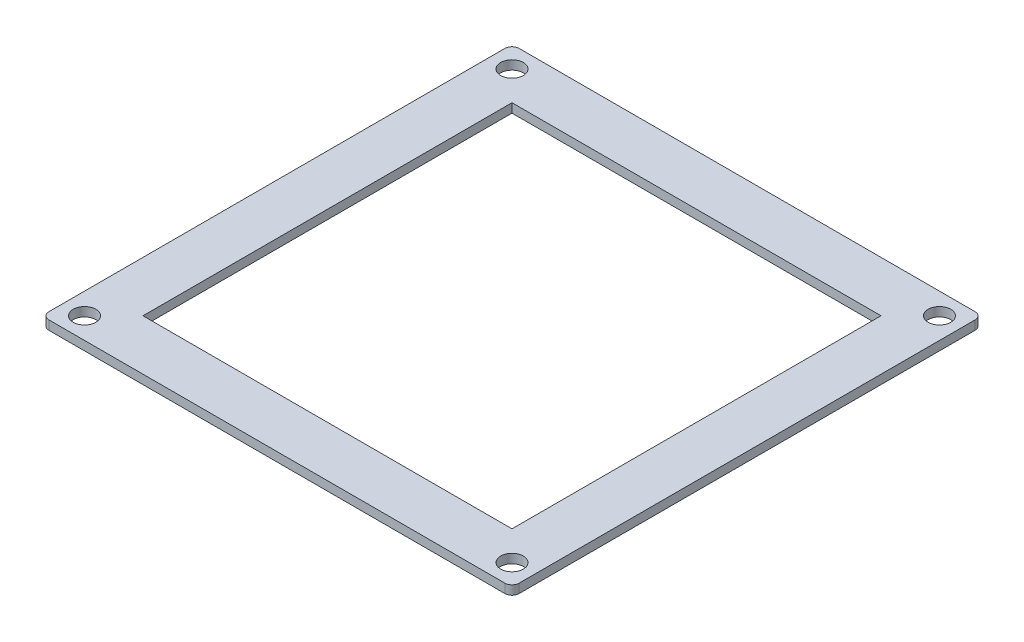
ISO-10303-21;
HEADER;
FILE_DESCRIPTION(('STEP AP214'),'2;1');
FILE_NAME('part.step','',(''),(''),'','','');
FILE_SCHEMA(('AUTOMOTIVE_DESIGN { 1 0 10303 214 1 1 1 1 }'));
ENDSEC;
DATA;
#1=APPLICATION_CONTEXT('core data for automotive mechanical design processes');
#2=APPLICATION_PROTOCOL_DEFINITION('international standard','automotive_design',2000,#1);
#3=PRODUCT_CONTEXT('',#1,'mechanical');
#4=PRODUCT('Part','Part','',(#3));
#5=PRODUCT_RELATED_PRODUCT_CATEGORY('part','',(#4));
#6=PRODUCT_DEFINITION_FORMATION('','',#4);
#7=PRODUCT_DEFINITION_CONTEXT('part definition',#1,'design');
#8=PRODUCT_DEFINITION('design','',#6,#7);
#9=PRODUCT_DEFINITION_SHAPE('','',#8);
#10=(LENGTH_UNIT() NAMED_UNIT(*) SI_UNIT(.MILLI.,.METRE.));
#11=(NAMED_UNIT(*) PLANE_ANGLE_UNIT() SI_UNIT($,.RADIAN.));
#12=(NAMED_UNIT(*) SI_UNIT($,.STERADIAN.) SOLID_ANGLE_UNIT());
#13=UNCERTAINTY_MEASURE_WITH_UNIT(LENGTH_MEASURE(1.E-05),#10,'distance_accuracy_value','');
#14=(GEOMETRIC_REPRESENTATION_CONTEXT(3) GLOBAL_UNCERTAINTY_ASSIGNED_CONTEXT((#13)) GLOBAL_UNIT_ASSIGNED_CONTEXT((#10,
#11,#12)) REPRESENTATION_CONTEXT('',''));
#15=CARTESIAN_POINT('',(0.,0.,0.));
#16=DIRECTION('',(0.,0.,1.));
#17=DIRECTION('',(1.,0.,0.));
#18=AXIS2_PLACEMENT_3D('',#15,#16,#17);
#19=CARTESIAN_POINT('',(0.,1.27,0.));
#20=DIRECTION('',(0.,1.,0.));
#21=DIRECTION('',(0.,0.,1.));
#22=AXIS2_PLACEMENT_3D('',#19,#20,#21);
#23=PLANE('',#22);
#24=CARTESIAN_POINT('',(30.,1.27,30.));
#25=DIRECTION('',(0.,1.,0.));
#26=DIRECTION('',(0.,0.,1.));
#27=AXIS2_PLACEMENT_3D('',#24,#25,#26);
#28=CIRCLE('',#27,1.59);
#29=CARTESIAN_POINT('',(30.,1.27,31.59));
#30=VERTEX_POINT('',#29);
#31=EDGE_CURVE('E195',#30,#30,#28,.T.);
#32=ORIENTED_EDGE('',*,*,#31,.F.);
#33=EDGE_LOOP('',(#32));
#34=FACE_BOUND('',#33,.T.);
#35=CARTESIAN_POINT('',(-30.,1.27,-30.));
#36=DIRECTION('',(0.,1.,0.));
#37=DIRECTION('',(0.,0.,1.));
#38=AXIS2_PLACEMENT_3D('',#35,#36,#37);
#39=CIRCLE('',#38,1.59);
#40=CARTESIAN_POINT('',(-30.,1.27,-28.41));
#41=VERTEX_POINT('',#40);
#42=EDGE_CURVE('E211',#41,#41,#39,.T.);
#43=ORIENTED_EDGE('',*,*,#42,.F.);
#44=EDGE_LOOP('',(#43));
#45=FACE_BOUND('',#44,.T.);
#46=DIRECTION('',(1.,0.,0.));
#47=VECTOR('',#46,1.);
#48=CARTESIAN_POINT('',(-33.,1.27,33.));
#49=LINE('',#48,#47);
#50=CARTESIAN_POINT('',(-32.,1.27,33.));
#51=VERTEX_POINT('',#50);
#52=CARTESIAN_POINT('',(32.,1.27,33.));
#53=VERTEX_POINT('',#52);
#54=EDGE_CURVE('E230',#51,#53,#49,.T.);
#55=ORIENTED_EDGE('',*,*,#54,.T.);
#56=CARTESIAN_POINT('',(32.,1.27,32.));
#57=DIRECTION('',(0.,1.,0.));
#58=DIRECTION('',(0.,0.,1.));
#59=AXIS2_PLACEMENT_3D('',#56,#57,#58);
#60=CIRCLE('',#59,1.);
#61=CARTESIAN_POINT('',(33.,1.27,32.));
#62=VERTEX_POINT('',#61);
#63=EDGE_CURVE('E281',#53,#62,#60,.T.);
#64=ORIENTED_EDGE('',*,*,#63,.T.);
#65=DIRECTION('',(0.,0.,-1.));
#66=VECTOR('',#65,1.);
#67=CARTESIAN_POINT('',(33.,1.27,-33.));
#68=LINE('',#67,#66);
#69=CARTESIAN_POINT('',(33.,1.27,-32.));
#70=VERTEX_POINT('',#69);
#71=EDGE_CURVE('E219',#62,#70,#68,.T.);
#72=ORIENTED_EDGE('',*,*,#71,.T.);
#73=CARTESIAN_POINT('',(32.,1.27,-32.));
#74=DIRECTION('',(0.,1.,0.));
#75=DIRECTION('',(0.,0.,1.));
#76=AXIS2_PLACEMENT_3D('',#73,#74,#75);
#77=CIRCLE('',#76,1.);
#78=CARTESIAN_POINT('',(32.,1.27,-33.));
#79=VERTEX_POINT('',#78);
#80=EDGE_CURVE('E273',#70,#79,#77,.T.);
#81=ORIENTED_EDGE('',*,*,#80,.T.);
#82=DIRECTION('',(-1.,0.,0.));
#83=VECTOR('',#82,1.);
#84=CARTESIAN_POINT('',(-33.,1.27,-33.));
#85=LINE('',#84,#83);
#86=CARTESIAN_POINT('',(-32.,1.27,-33.));
#87=VERTEX_POINT('',#86);
#88=EDGE_CURVE('E223',#79,#87,#85,.T.);
#89=ORIENTED_EDGE('',*,*,#88,.T.);
#90=CARTESIAN_POINT('',(-32.,1.27,-32.));
#91=DIRECTION('',(0.,1.,0.));
#92=DIRECTION('',(0.,0.,1.));
#93=AXIS2_PLACEMENT_3D('',#90,#91,#92);
#94=CIRCLE('',#93,1.);
#95=CARTESIAN_POINT('',(-33.,1.27,-32.));
#96=VERTEX_POINT('',#95);
#97=EDGE_CURVE('E65',#87,#96,#94,.T.);
#98=ORIENTED_EDGE('',*,*,#97,.T.);
#99=DIRECTION('',(0.,0.,1.));
#100=VECTOR('',#99,1.);
#101=CARTESIAN_POINT('',(-33.,1.27,-33.));
#102=LINE('',#101,#100);
#103=CARTESIAN_POINT('',(-33.,1.27,32.));
#104=VERTEX_POINT('',#103);
#105=EDGE_CURVE('E227',#96,#104,#102,.T.);
#106=ORIENTED_EDGE('',*,*,#105,.T.);
#107=CARTESIAN_POINT('',(-32.,1.27,32.));
#108=DIRECTION('',(0.,1.,0.));
#109=DIRECTION('',(0.,0.,1.));
#110=AXIS2_PLACEMENT_3D('',#107,#108,#109);
#111=CIRCLE('',#110,1.);
#112=EDGE_CURVE('E278',#104,#51,#111,.T.);
#113=ORIENTED_EDGE('',*,*,#112,.T.);
#114=EDGE_LOOP('',(#55,#64,#72,#81,#89,#98,#106,#113));
#115=FACE_BOUND('',#114,.T.);
#116=CARTESIAN_POINT('',(30.,1.27,-30.));
#117=DIRECTION('',(0.,1.,0.));
#118=DIRECTION('',(0.,0.,1.));
#119=AXIS2_PLACEMENT_3D('',#116,#117,#118);
#120=CIRCLE('',#119,1.59);
#121=CARTESIAN_POINT('',(30.,1.27,-28.41));
#122=VERTEX_POINT('',#121);
#123=EDGE_CURVE('E203',#122,#122,#120,.T.);
#124=ORIENTED_EDGE('',*,*,#123,.F.);
#125=EDGE_LOOP('',(#124));
#126=FACE_BOUND('',#125,.T.);
#127=CARTESIAN_POINT('',(-30.,1.27,30.));
#128=DIRECTION('',(0.,1.,0.));
#129=DIRECTION('',(0.,0.,1.));
#130=AXIS2_PLACEMENT_3D('',#127,#128,#129);
#131=CIRCLE('',#130,1.59);
#132=CARTESIAN_POINT('',(-30.,1.27,31.59));
#133=VERTEX_POINT('',#132);
#134=EDGE_CURVE('E187',#133,#133,#131,.T.);
#135=ORIENTED_EDGE('',*,*,#134,.F.);
#136=EDGE_LOOP('',(#135));
#137=FACE_BOUND('',#136,.T.);
#138=DIRECTION('',(-1.,0.,0.));
#139=VECTOR('',#138,1.);
#140=CARTESIAN_POINT('',(-25.9,1.27,-25.9));
#141=LINE('',#140,#139);
#142=CARTESIAN_POINT('',(25.9,1.27,-25.9));
#143=VERTEX_POINT('',#142);
#144=CARTESIAN_POINT('',(-25.9,1.27,-25.9));
#145=VERTEX_POINT('',#144);
#146=EDGE_CURVE('E145',#143,#145,#141,.T.);
#147=ORIENTED_EDGE('',*,*,#146,.F.);
#148=DIRECTION('',(0.,0.,-1.));
#149=VECTOR('',#148,1.);
#150=CARTESIAN_POINT('',(25.9,1.27,-25.9));
#151=LINE('',#150,#149);
#152=CARTESIAN_POINT('',(25.9,1.27,25.9));
#153=VERTEX_POINT('',#152);
#154=EDGE_CURVE('E134',#153,#143,#151,.T.);
#155=ORIENTED_EDGE('',*,*,#154,.F.);
#156=DIRECTION('',(1.,0.,0.));
#157=VECTOR('',#156,1.);
#158=CARTESIAN_POINT('',(-25.9,1.27,25.9));
#159=LINE('',#158,#157);
#160=CARTESIAN_POINT('',(-25.9,1.27,25.9));
#161=VERTEX_POINT('',#160);
#162=EDGE_CURVE('E163',#161,#153,#159,.T.);
#163=ORIENTED_EDGE('',*,*,#162,.F.);
#164=DIRECTION('',(0.,0.,1.));
#165=VECTOR('',#164,1.);
#166=CARTESIAN_POINT('',(-25.9,1.27,-25.9));
#167=LINE('',#166,#165);
#168=EDGE_CURVE('E159',#145,#161,#167,.T.);
#169=ORIENTED_EDGE('',*,*,#168,.F.);
#170=EDGE_LOOP('',(#147,#155,#163,#169));
#171=FACE_BOUND('',#170,.T.);
#172=ADVANCED_FACE('F42',(#34,#45,#115,#126,#137,#171),#23,.T.);
#173=CARTESIAN_POINT('',(0.,0.,0.));
#174=DIRECTION('',(0.,1.,0.));
#175=DIRECTION('',(0.,0.,1.));
#176=AXIS2_PLACEMENT_3D('',#173,#174,#175);
#177=PLANE('',#176);
#178=CARTESIAN_POINT('',(-30.,0.,30.));
#179=DIRECTION('',(0.,1.,0.));
#180=DIRECTION('',(0.,0.,1.));
#181=AXIS2_PLACEMENT_3D('',#178,#179,#180);
#182=CIRCLE('',#181,1.59);
#183=CARTESIAN_POINT('',(-30.,0.,31.59));
#184=VERTEX_POINT('',#183);
#185=EDGE_CURVE('E154',#184,#184,#182,.T.);
#186=ORIENTED_EDGE('',*,*,#185,.T.);
#187=EDGE_LOOP('',(#186));
#188=FACE_BOUND('',#187,.T.);
#189=CARTESIAN_POINT('',(30.,0.,30.));
#190=DIRECTION('',(0.,1.,0.));
#191=DIRECTION('',(0.,0.,1.));
#192=AXIS2_PLACEMENT_3D('',#189,#190,#191);
#193=CIRCLE('',#192,1.59);
#194=CARTESIAN_POINT('',(30.,0.,31.59));
#195=VERTEX_POINT('',#194);
#196=EDGE_CURVE('E191',#195,#195,#193,.T.);
#197=ORIENTED_EDGE('',*,*,#196,.T.);
#198=EDGE_LOOP('',(#197));
#199=FACE_BOUND('',#198,.T.);
#200=CARTESIAN_POINT('',(30.,0.,-30.));
#201=DIRECTION('',(0.,1.,0.));
#202=DIRECTION('',(0.,0.,1.));
#203=AXIS2_PLACEMENT_3D('',#200,#201,#202);
#204=CIRCLE('',#203,1.59);
#205=CARTESIAN_POINT('',(30.,0.,-28.41));
#206=VERTEX_POINT('',#205);
#207=EDGE_CURVE('E199',#206,#206,#204,.T.);
#208=ORIENTED_EDGE('',*,*,#207,.T.);
#209=EDGE_LOOP('',(#208));
#210=FACE_BOUND('',#209,.T.);
#211=CARTESIAN_POINT('',(-30.,0.,-30.));
#212=DIRECTION('',(0.,1.,0.));
#213=DIRECTION('',(0.,0.,1.));
#214=AXIS2_PLACEMENT_3D('',#211,#212,#213);
#215=CIRCLE('',#214,1.59);
#216=CARTESIAN_POINT('',(-30.,0.,-28.41));
#217=VERTEX_POINT('',#216);
#218=EDGE_CURVE('E207',#217,#217,#215,.T.);
#219=ORIENTED_EDGE('',*,*,#218,.T.);
#220=EDGE_LOOP('',(#219));
#221=FACE_BOUND('',#220,.T.);
#222=DIRECTION('',(0.,0.,-1.));
#223=VECTOR('',#222,1.);
#224=CARTESIAN_POINT('',(33.,0.,-33.));
#225=LINE('',#224,#223);
#226=CARTESIAN_POINT('',(33.,0.,32.));
#227=VERTEX_POINT('',#226);
#228=CARTESIAN_POINT('',(33.,0.,-32.));
#229=VERTEX_POINT('',#228);
#230=EDGE_CURVE('E215',#227,#229,#225,.T.);
#231=ORIENTED_EDGE('',*,*,#230,.F.);
#232=CARTESIAN_POINT('',(32.,0.,32.));
#233=DIRECTION('',(0.,1.,0.));
#234=DIRECTION('',(0.,0.,1.));
#235=AXIS2_PLACEMENT_3D('',#232,#233,#234);
#236=CIRCLE('',#235,1.);
#237=CARTESIAN_POINT('',(32.,0.,33.));
#238=VERTEX_POINT('',#237);
#239=EDGE_CURVE('E263',#227,#238,#236,.F.);
#240=ORIENTED_EDGE('',*,*,#239,.T.);
#241=DIRECTION('',(1.,0.,0.));
#242=VECTOR('',#241,1.);
#243=CARTESIAN_POINT('',(-33.,0.,33.));
#244=LINE('',#243,#242);
#245=CARTESIAN_POINT('',(-32.,0.,33.));
#246=VERTEX_POINT('',#245);
#247=EDGE_CURVE('E224',#246,#238,#244,.T.);
#248=ORIENTED_EDGE('',*,*,#247,.F.);
#249=CARTESIAN_POINT('',(-32.,0.,32.));
#250=DIRECTION('',(0.,1.,0.));
#251=DIRECTION('',(0.,0.,1.));
#252=AXIS2_PLACEMENT_3D('',#249,#250,#251);
#253=CIRCLE('',#252,1.);
#254=CARTESIAN_POINT('',(-33.,0.,32.));
#255=VERTEX_POINT('',#254);
#256=EDGE_CURVE('E260',#246,#255,#253,.F.);
#257=ORIENTED_EDGE('',*,*,#256,.T.);
#258=DIRECTION('',(0.,0.,1.));
#259=VECTOR('',#258,1.);
#260=CARTESIAN_POINT('',(-33.,0.,-33.));
#261=LINE('',#260,#259);
#262=CARTESIAN_POINT('',(-33.,0.,-32.));
#263=VERTEX_POINT('',#262);
#264=EDGE_CURVE('E242',#263,#255,#261,.T.);
#265=ORIENTED_EDGE('',*,*,#264,.F.);
#266=CARTESIAN_POINT('',(-32.,0.,-32.));
#267=DIRECTION('',(0.,1.,0.));
#268=DIRECTION('',(0.,0.,1.));
#269=AXIS2_PLACEMENT_3D('',#266,#267,#268);
#270=CIRCLE('',#269,1.);
#271=CARTESIAN_POINT('',(-32.,0.,-33.));
#272=VERTEX_POINT('',#271);
#273=EDGE_CURVE('E257',#263,#272,#270,.F.);
#274=ORIENTED_EDGE('',*,*,#273,.T.);
#275=DIRECTION('',(-1.,0.,0.));
#276=VECTOR('',#275,1.);
#277=CARTESIAN_POINT('',(-33.,0.,-33.));
#278=LINE('',#277,#276);
#279=CARTESIAN_POINT('',(32.,0.,-33.));
#280=VERTEX_POINT('',#279);
#281=EDGE_CURVE('E238',#280,#272,#278,.T.);
#282=ORIENTED_EDGE('',*,*,#281,.F.);
#283=CARTESIAN_POINT('',(32.,0.,-32.));
#284=DIRECTION('',(0.,1.,0.));
#285=DIRECTION('',(0.,0.,1.));
#286=AXIS2_PLACEMENT_3D('',#283,#284,#285);
#287=CIRCLE('',#286,1.);
#288=EDGE_CURVE('E254',#280,#229,#287,.F.);
#289=ORIENTED_EDGE('',*,*,#288,.T.);
#290=EDGE_LOOP('',(#231,#240,#248,#257,#265,#274,#282,#289));
#291=FACE_BOUND('',#290,.T.);
#292=DIRECTION('',(0.,0.,-1.));
#293=VECTOR('',#292,1.);
#294=CARTESIAN_POINT('',(25.9,0.,-25.9));
#295=LINE('',#294,#293);
#296=CARTESIAN_POINT('',(25.9,0.,25.9));
#297=VERTEX_POINT('',#296);
#298=CARTESIAN_POINT('',(25.9,0.,-25.9));
#299=VERTEX_POINT('',#298);
#300=EDGE_CURVE('E168',#297,#299,#295,.T.);
#301=ORIENTED_EDGE('',*,*,#300,.T.);
#302=DIRECTION('',(-1.,0.,0.));
#303=VECTOR('',#302,1.);
#304=CARTESIAN_POINT('',(-25.9,0.,-25.9));
#305=LINE('',#304,#303);
#306=CARTESIAN_POINT('',(-25.9,0.,-25.9));
#307=VERTEX_POINT('',#306);
#308=EDGE_CURVE('E152',#299,#307,#305,.T.);
#309=ORIENTED_EDGE('',*,*,#308,.T.);
#310=DIRECTION('',(0.,0.,1.));
#311=VECTOR('',#310,1.);
#312=CARTESIAN_POINT('',(-25.9,0.,-25.9));
#313=LINE('',#312,#311);
#314=CARTESIAN_POINT('',(-25.9,0.,25.9));
#315=VERTEX_POINT('',#314);
#316=EDGE_CURVE('E173',#307,#315,#313,.T.);
#317=ORIENTED_EDGE('',*,*,#316,.T.);
#318=DIRECTION('',(1.,0.,0.));
#319=VECTOR('',#318,1.);
#320=CARTESIAN_POINT('',(-25.9,0.,25.9));
#321=LINE('',#320,#319);
#322=EDGE_CURVE('E146',#315,#297,#321,.T.);
#323=ORIENTED_EDGE('',*,*,#322,.T.);
#324=EDGE_LOOP('',(#301,#309,#317,#323));
#325=FACE_BOUND('',#324,.T.);
#326=ADVANCED_FACE('F301',(#188,#199,#210,#221,#291,#325),#177,.F.);
#327=CARTESIAN_POINT('',(33.,1.27,-33.));
#328=DIRECTION('',(-1.,0.,0.));
#329=DIRECTION('',(0.,0.,1.));
#330=AXIS2_PLACEMENT_3D('',#327,#328,#329);
#331=PLANE('',#330);
#332=ORIENTED_EDGE('',*,*,#71,.F.);
#333=DIRECTION('',(0.,-1.,0.));
#334=VECTOR('',#333,1.);
#335=CARTESIAN_POINT('',(33.,1.27,32.));
#336=LINE('',#335,#334);
#337=EDGE_CURVE('E250',#62,#227,#336,.T.);
#338=ORIENTED_EDGE('',*,*,#337,.T.);
#339=ORIENTED_EDGE('',*,*,#230,.T.);
#340=DIRECTION('',(0.,-1.,0.));
#341=VECTOR('',#340,1.);
#342=CARTESIAN_POINT('',(33.,1.27,-32.));
#343=LINE('',#342,#341);
#344=EDGE_CURVE('E234',#229,#70,#343,.F.);
#345=ORIENTED_EDGE('',*,*,#344,.T.);
#346=EDGE_LOOP('',(#332,#338,#339,#345));
#347=FACE_BOUND('',#346,.T.);
#348=ADVANCED_FACE('F324',(#347),#331,.F.);
#349=CARTESIAN_POINT('',(-33.,1.27,-33.));
#350=DIRECTION('',(0.,0.,1.));
#351=DIRECTION('',(1.,0.,0.));
#352=AXIS2_PLACEMENT_3D('',#349,#350,#351);
#353=PLANE('',#352);
#354=ORIENTED_EDGE('',*,*,#281,.T.);
#355=DIRECTION('',(0.,-1.,0.));
#356=VECTOR('',#355,1.);
#357=CARTESIAN_POINT('',(-32.,1.27,-33.));
#358=LINE('',#357,#356);
#359=EDGE_CURVE('E11',#272,#87,#358,.F.);
#360=ORIENTED_EDGE('',*,*,#359,.T.);
#361=ORIENTED_EDGE('',*,*,#88,.F.);
#362=DIRECTION('',(0.,-1.,0.));
#363=VECTOR('',#362,1.);
#364=CARTESIAN_POINT('',(32.,1.27,-33.));
#365=LINE('',#364,#363);
#366=EDGE_CURVE('E51',#79,#280,#365,.T.);
#367=ORIENTED_EDGE('',*,*,#366,.T.);
#368=EDGE_LOOP('',(#354,#360,#361,#367));
#369=FACE_BOUND('',#368,.T.);
#370=ADVANCED_FACE('F295',(#369),#353,.F.);
#371=CARTESIAN_POINT('',(-33.,1.27,-33.));
#372=DIRECTION('',(1.,0.,0.));
#373=DIRECTION('',(0.,0.,-1.));
#374=AXIS2_PLACEMENT_3D('',#371,#372,#373);
#375=PLANE('',#374);
#376=ORIENTED_EDGE('',*,*,#264,.T.);
#377=DIRECTION('',(0.,-1.,0.));
#378=VECTOR('',#377,1.);
#379=CARTESIAN_POINT('',(-33.,1.27,32.));
#380=LINE('',#379,#378);
#381=EDGE_CURVE('E58',#255,#104,#380,.F.);
#382=ORIENTED_EDGE('',*,*,#381,.T.);
#383=ORIENTED_EDGE('',*,*,#105,.F.);
#384=DIRECTION('',(0.,-1.,0.));
#385=VECTOR('',#384,1.);
#386=CARTESIAN_POINT('',(-33.,1.27,-32.));
#387=LINE('',#386,#385);
#388=EDGE_CURVE('E284',#96,#263,#387,.T.);
#389=ORIENTED_EDGE('',*,*,#388,.T.);
#390=EDGE_LOOP('',(#376,#382,#383,#389));
#391=FACE_BOUND('',#390,.T.);
#392=ADVANCED_FACE('F307',(#391),#375,.F.);
#393=CARTESIAN_POINT('',(-33.,1.27,33.));
#394=DIRECTION('',(0.,0.,-1.));
#395=DIRECTION('',(-1.,0.,0.));
#396=AXIS2_PLACEMENT_3D('',#393,#394,#395);
#397=PLANE('',#396);
#398=ORIENTED_EDGE('',*,*,#247,.T.);
#399=DIRECTION('',(0.,-1.,0.));
#400=VECTOR('',#399,1.);
#401=CARTESIAN_POINT('',(32.,1.27,33.));
#402=LINE('',#401,#400);
#403=EDGE_CURVE('E270',#238,#53,#402,.F.);
#404=ORIENTED_EDGE('',*,*,#403,.T.);
#405=ORIENTED_EDGE('',*,*,#54,.F.);
#406=DIRECTION('',(0.,-1.,0.));
#407=VECTOR('',#406,1.);
#408=CARTESIAN_POINT('',(-32.,1.27,33.));
#409=LINE('',#408,#407);
#410=EDGE_CURVE('E266',#51,#246,#409,.T.);
#411=ORIENTED_EDGE('',*,*,#410,.T.);
#412=EDGE_LOOP('',(#398,#404,#405,#411));
#413=FACE_BOUND('',#412,.T.);
#414=ADVANCED_FACE('F316',(#413),#397,.F.);
#415=CARTESIAN_POINT('',(-30.,1.27,-30.));
#416=DIRECTION('',(0.,-1.,0.));
#417=DIRECTION('',(0.,0.,-1.));
#418=AXIS2_PLACEMENT_3D('',#415,#416,#417);
#419=CYLINDRICAL_SURFACE('',#418,1.59);
#420=ORIENTED_EDGE('',*,*,#42,.T.);
#421=EDGE_LOOP('',(#420));
#422=FACE_BOUND('',#421,.T.);
#423=ORIENTED_EDGE('',*,*,#218,.F.);
#424=EDGE_LOOP('',(#423));
#425=FACE_BOUND('',#424,.T.);
#426=ADVANCED_FACE('F341',(#422,#425),#419,.F.);
#427=CARTESIAN_POINT('',(30.,1.27,-30.));
#428=DIRECTION('',(0.,-1.,0.));
#429=DIRECTION('',(0.,0.,-1.));
#430=AXIS2_PLACEMENT_3D('',#427,#428,#429);
#431=CYLINDRICAL_SURFACE('',#430,1.59);
#432=ORIENTED_EDGE('',*,*,#123,.T.);
#433=EDGE_LOOP('',(#432));
#434=FACE_BOUND('',#433,.T.);
#435=ORIENTED_EDGE('',*,*,#207,.F.);
#436=EDGE_LOOP('',(#435));
#437=FACE_BOUND('',#436,.T.);
#438=ADVANCED_FACE('F436',(#434,#437),#431,.F.);
#439=CARTESIAN_POINT('',(30.,1.27,30.));
#440=DIRECTION('',(0.,-1.,0.));
#441=DIRECTION('',(0.,0.,-1.));
#442=AXIS2_PLACEMENT_3D('',#439,#440,#441);
#443=CYLINDRICAL_SURFACE('',#442,1.59);
#444=ORIENTED_EDGE('',*,*,#31,.T.);
#445=EDGE_LOOP('',(#444));
#446=FACE_BOUND('',#445,.T.);
#447=ORIENTED_EDGE('',*,*,#196,.F.);
#448=EDGE_LOOP('',(#447));
#449=FACE_BOUND('',#448,.T.);
#450=ADVANCED_FACE('F426',(#446,#449),#443,.F.);
#451=CARTESIAN_POINT('',(-30.,1.27,30.));
#452=DIRECTION('',(0.,-1.,0.));
#453=DIRECTION('',(0.,0.,-1.));
#454=AXIS2_PLACEMENT_3D('',#451,#452,#453);
#455=CYLINDRICAL_SURFACE('',#454,1.59);
#456=ORIENTED_EDGE('',*,*,#134,.T.);
#457=EDGE_LOOP('',(#456));
#458=FACE_BOUND('',#457,.T.);
#459=ORIENTED_EDGE('',*,*,#185,.F.);
#460=EDGE_LOOP('',(#459));
#461=FACE_BOUND('',#460,.T.);
#462=ADVANCED_FACE('F417',(#458,#461),#455,.F.);
#463=CARTESIAN_POINT('',(25.9,1.27,-25.9));
#464=DIRECTION('',(-1.,0.,0.));
#465=DIRECTION('',(0.,0.,1.));
#466=AXIS2_PLACEMENT_3D('',#463,#464,#465);
#467=PLANE('',#466);
#468=ORIENTED_EDGE('',*,*,#300,.F.);
#469=DIRECTION('',(0.,-1.,0.));
#470=VECTOR('',#469,1.);
#471=CARTESIAN_POINT('',(25.9,1.27,25.9));
#472=LINE('',#471,#470);
#473=EDGE_CURVE('E140',#153,#297,#472,.T.);
#474=ORIENTED_EDGE('',*,*,#473,.F.);
#475=ORIENTED_EDGE('',*,*,#154,.T.);
#476=DIRECTION('',(0.,-1.,0.));
#477=VECTOR('',#476,1.);
#478=CARTESIAN_POINT('',(25.9,1.27,-25.9));
#479=LINE('',#478,#477);
#480=EDGE_CURVE('E137',#143,#299,#479,.T.);
#481=ORIENTED_EDGE('',*,*,#480,.T.);
#482=EDGE_LOOP('',(#468,#474,#475,#481));
#483=FACE_BOUND('',#482,.T.);
#484=ADVANCED_FACE('F136',(#483),#467,.T.);
#485=CARTESIAN_POINT('',(-25.9,1.27,-25.9));
#486=DIRECTION('',(0.,0.,1.));
#487=DIRECTION('',(1.,0.,0.));
#488=AXIS2_PLACEMENT_3D('',#485,#486,#487);
#489=PLANE('',#488);
#490=ORIENTED_EDGE('',*,*,#308,.F.);
#491=ORIENTED_EDGE('',*,*,#480,.F.);
#492=ORIENTED_EDGE('',*,*,#146,.T.);
#493=DIRECTION('',(0.,-1.,0.));
#494=VECTOR('',#493,1.);
#495=CARTESIAN_POINT('',(-25.9,1.27,-25.9));
#496=LINE('',#495,#494);
#497=EDGE_CURVE('E155',#145,#307,#496,.T.);
#498=ORIENTED_EDGE('',*,*,#497,.T.);
#499=EDGE_LOOP('',(#490,#491,#492,#498));
#500=FACE_BOUND('',#499,.T.);
#501=ADVANCED_FACE('F149',(#500),#489,.T.);
#502=CARTESIAN_POINT('',(-25.9,1.27,-25.9));
#503=DIRECTION('',(1.,0.,0.));
#504=DIRECTION('',(0.,0.,-1.));
#505=AXIS2_PLACEMENT_3D('',#502,#503,#504);
#506=PLANE('',#505);
#507=ORIENTED_EDGE('',*,*,#316,.F.);
#508=ORIENTED_EDGE('',*,*,#497,.F.);
#509=ORIENTED_EDGE('',*,*,#168,.T.);
#510=DIRECTION('',(0.,-1.,0.));
#511=VECTOR('',#510,1.);
#512=CARTESIAN_POINT('',(-25.9,1.27,25.9));
#513=LINE('',#512,#511);
#514=EDGE_CURVE('E182',#161,#315,#513,.T.);
#515=ORIENTED_EDGE('',*,*,#514,.T.);
#516=EDGE_LOOP('',(#507,#508,#509,#515));
#517=FACE_BOUND('',#516,.T.);
#518=ADVANCED_FACE('F390',(#517),#506,.T.);
#519=CARTESIAN_POINT('',(-25.9,1.27,25.9));
#520=DIRECTION('',(0.,0.,-1.));
#521=DIRECTION('',(-1.,0.,0.));
#522=AXIS2_PLACEMENT_3D('',#519,#520,#521);
#523=PLANE('',#522);
#524=ORIENTED_EDGE('',*,*,#322,.F.);
#525=ORIENTED_EDGE('',*,*,#514,.F.);
#526=ORIENTED_EDGE('',*,*,#162,.T.);
#527=ORIENTED_EDGE('',*,*,#473,.T.);
#528=EDGE_LOOP('',(#524,#525,#526,#527));
#529=FACE_BOUND('',#528,.T.);
#530=ADVANCED_FACE('F354',(#529),#523,.T.);
#531=CARTESIAN_POINT('',(32.,1.27,32.));
#532=DIRECTION('',(0.,-1.,0.));
#533=DIRECTION('',(0.,0.,-1.));
#534=AXIS2_PLACEMENT_3D('',#531,#532,#533);
#535=CYLINDRICAL_SURFACE('',#534,1.);
#536=ORIENTED_EDGE('',*,*,#63,.F.);
#537=ORIENTED_EDGE('',*,*,#403,.F.);
#538=ORIENTED_EDGE('',*,*,#239,.F.);
#539=ORIENTED_EDGE('',*,*,#337,.F.);
#540=EDGE_LOOP('',(#536,#537,#538,#539));
#541=FACE_BOUND('',#540,.T.);
#542=ADVANCED_FACE('F321',(#541),#535,.T.);
#543=CARTESIAN_POINT('',(-32.,1.27,32.));
#544=DIRECTION('',(0.,-1.,0.));
#545=DIRECTION('',(0.,0.,-1.));
#546=AXIS2_PLACEMENT_3D('',#543,#544,#545);
#547=CYLINDRICAL_SURFACE('',#546,1.);
#548=ORIENTED_EDGE('',*,*,#112,.F.);
#549=ORIENTED_EDGE('',*,*,#381,.F.);
#550=ORIENTED_EDGE('',*,*,#256,.F.);
#551=ORIENTED_EDGE('',*,*,#410,.F.);
#552=EDGE_LOOP('',(#548,#549,#550,#551));
#553=FACE_BOUND('',#552,.T.);
#554=ADVANCED_FACE('F313',(#553),#547,.T.);
#555=CARTESIAN_POINT('',(-32.,1.27,-32.));
#556=DIRECTION('',(0.,-1.,0.));
#557=DIRECTION('',(0.,0.,-1.));
#558=AXIS2_PLACEMENT_3D('',#555,#556,#557);
#559=CYLINDRICAL_SURFACE('',#558,1.);
#560=ORIENTED_EDGE('',*,*,#97,.F.);
#561=ORIENTED_EDGE('',*,*,#359,.F.);
#562=ORIENTED_EDGE('',*,*,#273,.F.);
#563=ORIENTED_EDGE('',*,*,#388,.F.);
#564=EDGE_LOOP('',(#560,#561,#562,#563));
#565=FACE_BOUND('',#564,.T.);
#566=ADVANCED_FACE('F306',(#565),#559,.T.);
#567=CARTESIAN_POINT('',(32.,1.27,-32.));
#568=DIRECTION('',(0.,-1.,0.));
#569=DIRECTION('',(0.,0.,-1.));
#570=AXIS2_PLACEMENT_3D('',#567,#568,#569);
#571=CYLINDRICAL_SURFACE('',#570,1.);
#572=ORIENTED_EDGE('',*,*,#80,.F.);
#573=ORIENTED_EDGE('',*,*,#344,.F.);
#574=ORIENTED_EDGE('',*,*,#288,.F.);
#575=ORIENTED_EDGE('',*,*,#366,.F.);
#576=EDGE_LOOP('',(#572,#573,#574,#575));
#577=FACE_BOUND('',#576,.T.);
#578=ADVANCED_FACE('F44',(#577),#571,.T.);
#579=CLOSED_SHELL('',(#172,#326,#348,#370,#392,#414,#426,#438,#450,#462,#484,#501,#518,#530,
#542,#554,#566,#578));
#580=MANIFOLD_SOLID_BREP('B2',#579);
#581=ADVANCED_BREP_SHAPE_REPRESENTATION('',(#18,#580),#14);
#582=SHAPE_DEFINITION_REPRESENTATION(#9,#581);
ENDSEC;
END-ISO-10303-21;
